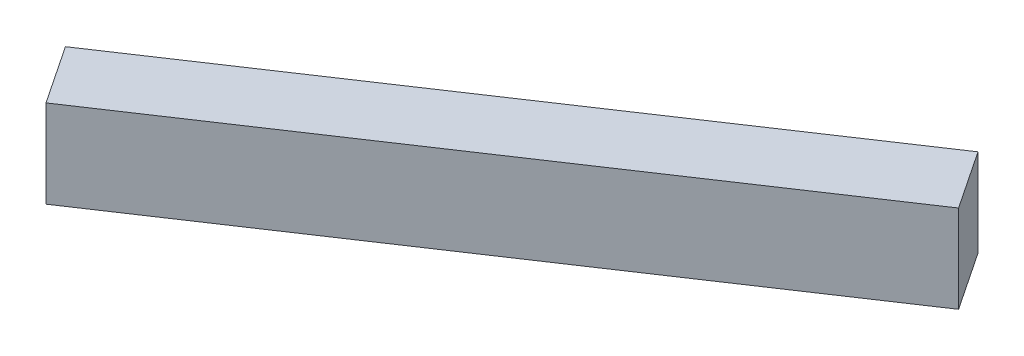
ISO-10303-21;
HEADER;
FILE_DESCRIPTION(('STEP AP214'),'2;1');
FILE_NAME('part.step','',(''),(''),'','','');
FILE_SCHEMA(('AUTOMOTIVE_DESIGN { 1 0 10303 214 1 1 1 1 }'));
ENDSEC;
DATA;
#1=APPLICATION_CONTEXT('core data for automotive mechanical design processes');
#2=APPLICATION_PROTOCOL_DEFINITION('international standard','automotive_design',2000,#1);
#3=PRODUCT_CONTEXT('',#1,'mechanical');
#4=PRODUCT('Part','Part','',(#3));
#5=PRODUCT_RELATED_PRODUCT_CATEGORY('part','',(#4));
#6=PRODUCT_DEFINITION_FORMATION('','',#4);
#7=PRODUCT_DEFINITION_CONTEXT('part definition',#1,'design');
#8=PRODUCT_DEFINITION('design','',#6,#7);
#9=PRODUCT_DEFINITION_SHAPE('','',#8);
#10=(LENGTH_UNIT() NAMED_UNIT(*) SI_UNIT(.MILLI.,.METRE.));
#11=(NAMED_UNIT(*) PLANE_ANGLE_UNIT() SI_UNIT($,.RADIAN.));
#12=(NAMED_UNIT(*) SI_UNIT($,.STERADIAN.) SOLID_ANGLE_UNIT());
#13=UNCERTAINTY_MEASURE_WITH_UNIT(LENGTH_MEASURE(1.E-05),#10,'distance_accuracy_value','');
#14=(GEOMETRIC_REPRESENTATION_CONTEXT(3) GLOBAL_UNCERTAINTY_ASSIGNED_CONTEXT((#13)) GLOBAL_UNIT_ASSIGNED_CONTEXT((#10,
#11,#12)) REPRESENTATION_CONTEXT('',''));
#15=CARTESIAN_POINT('',(0.,0.,0.));
#16=DIRECTION('',(0.,0.,1.));
#17=DIRECTION('',(1.,0.,0.));
#18=AXIS2_PLACEMENT_3D('',#15,#16,#17);
#19=CARTESIAN_POINT('',(14.9151382581835,7.874,-10.0731254976328));
#20=DIRECTION('',(0.555057374235212,0.,0.831812064896339));
#21=DIRECTION('',(0.831812064896339,0.,-0.555057374235212));
#22=AXIS2_PLACEMENT_3D('',#19,#20,#21);
#23=PLANE('',#22);
#24=DIRECTION('',(0.,1.,0.));
#25=VECTOR('',#24,1.);
#26=CARTESIAN_POINT('',(14.9151382581835,7.874,-10.0731254976328));
#27=LINE('',#26,#25);
#28=CARTESIAN_POINT('',(14.9151382581835,7.62,-10.0731254976328));
#29=VERTEX_POINT('',#28);
#30=CARTESIAN_POINT('',(14.9151382581835,7.874,-10.0731254976328));
#31=VERTEX_POINT('',#30);
#32=EDGE_CURVE('E20',#29,#31,#27,.T.);
#33=ORIENTED_EDGE('',*,*,#32,.T.);
#34=DIRECTION('',(0.83181206489633,0.,-0.555057374235226));
#35=VECTOR('',#34,1.);
#36=CARTESIAN_POINT('',(14.9151382581835,7.874,-10.0731254976328));
#37=LINE('',#36,#35);
#38=CARTESIAN_POINT('',(16.499740241811,7.874,-11.1305097955509));
#39=VERTEX_POINT('',#38);
#40=EDGE_CURVE('E55',#31,#39,#37,.T.);
#41=ORIENTED_EDGE('',*,*,#40,.T.);
#42=DIRECTION('',(0.,1.,0.));
#43=VECTOR('',#42,1.);
#44=CARTESIAN_POINT('',(16.499740241811,7.874,-11.1305097955509));
#45=LINE('',#44,#43);
#46=CARTESIAN_POINT('',(16.499740241811,7.62,-11.1305097955509));
#47=VERTEX_POINT('',#46);
#48=EDGE_CURVE('E76',#39,#47,#45,.F.);
#49=ORIENTED_EDGE('',*,*,#48,.T.);
#50=DIRECTION('',(0.83181206489633,0.,-0.555057374235226));
#51=VECTOR('',#50,1.);
#52=CARTESIAN_POINT('',(14.9151382581835,7.62,-10.0731254976328));
#53=LINE('',#52,#51);
#54=EDGE_CURVE('E58',#29,#47,#53,.T.);
#55=ORIENTED_EDGE('',*,*,#54,.F.);
#56=EDGE_LOOP('',(#33,#41,#49,#55));
#57=FACE_BOUND('',#56,.T.);
#58=ADVANCED_FACE('F17',(#57),#23,.F.);
#59=CARTESIAN_POINT('',(14.9151382581835,7.874,-10.0731254976328));
#60=DIRECTION('',(0.831812064896312,0.,-0.555057374235253));
#61=DIRECTION('',(-0.555057374235253,0.,-0.831812064896312));
#62=AXIS2_PLACEMENT_3D('',#59,#60,#61);
#63=PLANE('',#62);
#64=DIRECTION('',(0.,1.,0.));
#65=VECTOR('',#64,1.);
#66=CARTESIAN_POINT('',(15.0279259166281,7.874,-9.90410128604587));
#67=LINE('',#66,#65);
#68=CARTESIAN_POINT('',(15.0279259166281,7.62,-9.90410128604587));
#69=VERTEX_POINT('',#68);
#70=CARTESIAN_POINT('',(15.0279259166281,7.874,-9.90410128604587));
#71=VERTEX_POINT('',#70);
#72=EDGE_CURVE('E73',#69,#71,#67,.T.);
#73=ORIENTED_EDGE('',*,*,#72,.T.);
#74=DIRECTION('',(-0.555057374235241,0.,-0.83181206489632));
#75=VECTOR('',#74,1.);
#76=CARTESIAN_POINT('',(15.0279259166281,7.874,-9.90410128604587));
#77=LINE('',#76,#75);
#78=EDGE_CURVE('E63',#71,#31,#77,.T.);
#79=ORIENTED_EDGE('',*,*,#78,.T.);
#80=ORIENTED_EDGE('',*,*,#32,.F.);
#81=DIRECTION('',(-0.555057374235241,0.,-0.83181206489632));
#82=VECTOR('',#81,1.);
#83=CARTESIAN_POINT('',(15.0279259166281,7.62,-9.90410128604587));
#84=LINE('',#83,#82);
#85=EDGE_CURVE('E80',#69,#29,#84,.T.);
#86=ORIENTED_EDGE('',*,*,#85,.F.);
#87=EDGE_LOOP('',(#73,#79,#80,#86));
#88=FACE_BOUND('',#87,.T.);
#89=ADVANCED_FACE('F72',(#88),#63,.F.);
#90=CARTESIAN_POINT('',(14.9151382581835,7.874,-10.0731254976328));
#91=DIRECTION('',(0.,-1.,0.));
#92=DIRECTION('',(0.,0.,-1.));
#93=AXIS2_PLACEMENT_3D('',#90,#91,#92);
#94=PLANE('',#93);
#95=ORIENTED_EDGE('',*,*,#78,.F.);
#96=DIRECTION('',(-0.831812064896338,0.,0.555057374235214));
#97=VECTOR('',#96,1.);
#98=CARTESIAN_POINT('',(15.0279259166281,7.874,-9.90410128604587));
#99=LINE('',#98,#97);
#100=CARTESIAN_POINT('',(16.6125279005129,7.874,-10.9614855841356));
#101=VERTEX_POINT('',#100);
#102=EDGE_CURVE('E83',#71,#101,#99,.F.);
#103=ORIENTED_EDGE('',*,*,#102,.T.);
#104=DIRECTION('',(0.555057375501502,0.,0.83181206405136));
#105=VECTOR('',#104,1.);
#106=CARTESIAN_POINT('',(16.499740241811,7.874,-11.1305097955509));
#107=LINE('',#106,#105);
#108=EDGE_CURVE('E69',#101,#39,#107,.F.);
#109=ORIENTED_EDGE('',*,*,#108,.T.);
#110=ORIENTED_EDGE('',*,*,#40,.F.);
#111=EDGE_LOOP('',(#95,#103,#109,#110));
#112=FACE_BOUND('',#111,.T.);
#113=ADVANCED_FACE('F66',(#112),#94,.F.);
#114=CARTESIAN_POINT('',(16.499740241811,7.874,-11.1305097955509));
#115=DIRECTION('',(-0.83181206405136,0.,0.555057375501502));
#116=DIRECTION('',(0.555057375501502,0.,0.83181206405136));
#117=AXIS2_PLACEMENT_3D('',#114,#115,#116);
#118=PLANE('',#117);
#119=ORIENTED_EDGE('',*,*,#48,.F.);
#120=ORIENTED_EDGE('',*,*,#108,.F.);
#121=DIRECTION('',(0.,1.,0.));
#122=VECTOR('',#121,1.);
#123=CARTESIAN_POINT('',(16.6125279005129,7.874,-10.9614855841356));
#124=LINE('',#123,#122);
#125=CARTESIAN_POINT('',(16.6125279005129,7.62,-10.9614855841356));
#126=VERTEX_POINT('',#125);
#127=EDGE_CURVE('E26',#101,#126,#124,.F.);
#128=ORIENTED_EDGE('',*,*,#127,.T.);
#129=DIRECTION('',(0.555057375501348,0.,0.831812064051463));
#130=VECTOR('',#129,1.);
#131=CARTESIAN_POINT('',(16.499740241811,7.62,-11.1305097955509));
#132=LINE('',#131,#130);
#133=EDGE_CURVE('E34',#47,#126,#132,.T.);
#134=ORIENTED_EDGE('',*,*,#133,.F.);
#135=EDGE_LOOP('',(#119,#120,#128,#134));
#136=FACE_BOUND('',#135,.T.);
#137=ADVANCED_FACE('F88',(#136),#118,.F.);
#138=CARTESIAN_POINT('',(14.9151382581835,7.62,-10.0731254976328));
#139=DIRECTION('',(0.,-1.,0.));
#140=DIRECTION('',(0.,0.,-1.));
#141=AXIS2_PLACEMENT_3D('',#138,#139,#140);
#142=PLANE('',#141);
#143=DIRECTION('',(-0.831812064896338,0.,0.555057374235214));
#144=VECTOR('',#143,1.);
#145=CARTESIAN_POINT('',(15.0279259166281,7.62,-9.90410128604587));
#146=LINE('',#145,#144);
#147=EDGE_CURVE('E11',#126,#69,#146,.T.);
#148=ORIENTED_EDGE('',*,*,#147,.T.);
#149=ORIENTED_EDGE('',*,*,#85,.T.);
#150=ORIENTED_EDGE('',*,*,#54,.T.);
#151=ORIENTED_EDGE('',*,*,#133,.T.);
#152=EDGE_LOOP('',(#148,#149,#150,#151));
#153=FACE_BOUND('',#152,.T.);
#154=ADVANCED_FACE('F91',(#153),#142,.T.);
#155=CARTESIAN_POINT('',(15.0279259166281,7.874,-9.90410128604587));
#156=DIRECTION('',(-0.555057374235214,0.,-0.831812064896338));
#157=DIRECTION('',(-0.831812064896338,0.,0.555057374235214));
#158=AXIS2_PLACEMENT_3D('',#155,#156,#157);
#159=PLANE('',#158);
#160=ORIENTED_EDGE('',*,*,#127,.F.);
#161=ORIENTED_EDGE('',*,*,#102,.F.);
#162=ORIENTED_EDGE('',*,*,#72,.F.);
#163=ORIENTED_EDGE('',*,*,#147,.F.);
#164=EDGE_LOOP('',(#160,#161,#162,#163));
#165=FACE_BOUND('',#164,.T.);
#166=ADVANCED_FACE('F90',(#165),#159,.F.);
#167=CLOSED_SHELL('',(#58,#89,#113,#137,#154,#166));
#168=MANIFOLD_SOLID_BREP('B1',#167);
#169=ADVANCED_BREP_SHAPE_REPRESENTATION('',(#18,#168),#14);
#170=SHAPE_DEFINITION_REPRESENTATION(#9,#169);
ENDSEC;
END-ISO-10303-21;
